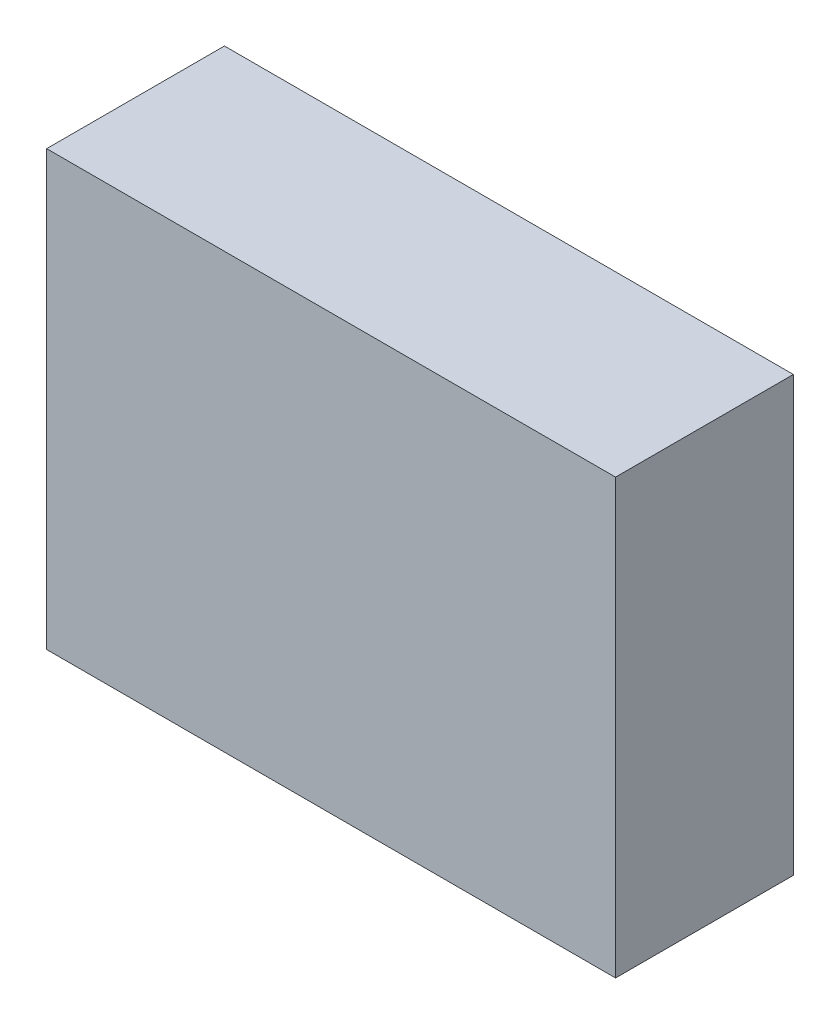
ISO-10303-21;
HEADER;
FILE_DESCRIPTION(('STEP AP214'),'2;1');
FILE_NAME('part.step','',(''),(''),'','','');
FILE_SCHEMA(('AUTOMOTIVE_DESIGN { 1 0 10303 214 1 1 1 1 }'));
ENDSEC;
DATA;
#1=APPLICATION_CONTEXT('core data for automotive mechanical design processes');
#2=APPLICATION_PROTOCOL_DEFINITION('international standard','automotive_design',2000,#1);
#3=PRODUCT_CONTEXT('',#1,'mechanical');
#4=PRODUCT('Part','Part','',(#3));
#5=PRODUCT_RELATED_PRODUCT_CATEGORY('part','',(#4));
#6=PRODUCT_DEFINITION_FORMATION('','',#4);
#7=PRODUCT_DEFINITION_CONTEXT('part definition',#1,'design');
#8=PRODUCT_DEFINITION('design','',#6,#7);
#9=PRODUCT_DEFINITION_SHAPE('','',#8);
#10=(LENGTH_UNIT() NAMED_UNIT(*) SI_UNIT(.MILLI.,.METRE.));
#11=(NAMED_UNIT(*) PLANE_ANGLE_UNIT() SI_UNIT($,.RADIAN.));
#12=(NAMED_UNIT(*) SI_UNIT($,.STERADIAN.) SOLID_ANGLE_UNIT());
#13=UNCERTAINTY_MEASURE_WITH_UNIT(LENGTH_MEASURE(1.E-05),#10,'distance_accuracy_value','');
#14=(GEOMETRIC_REPRESENTATION_CONTEXT(3) GLOBAL_UNCERTAINTY_ASSIGNED_CONTEXT((#13)) GLOBAL_UNIT_ASSIGNED_CONTEXT((#10,
#11,#12)) REPRESENTATION_CONTEXT('',''));
#15=CARTESIAN_POINT('',(0.,0.,0.));
#16=DIRECTION('',(0.,0.,1.));
#17=DIRECTION('',(1.,0.,0.));
#18=AXIS2_PLACEMENT_3D('',#15,#16,#17);
#19=CARTESIAN_POINT('',(-8.00000000000001,-6.1,5.));
#20=DIRECTION('',(1.,0.,0.));
#21=DIRECTION('',(0.,0.,-1.));
#22=AXIS2_PLACEMENT_3D('',#19,#20,#21);
#23=PLANE('',#22);
#24=DIRECTION('',(0.,-1.,0.));
#25=VECTOR('',#24,1.);
#26=CARTESIAN_POINT('',(-8.00000000000001,-6.1,0.));
#27=LINE('',#26,#25);
#28=CARTESIAN_POINT('',(-8.00000000000001,6.1,0.));
#29=VERTEX_POINT('',#28);
#30=CARTESIAN_POINT('',(-8.00000000000001,-6.1,0.));
#31=VERTEX_POINT('',#30);
#32=EDGE_CURVE('E101',#29,#31,#27,.T.);
#33=ORIENTED_EDGE('',*,*,#32,.T.);
#34=DIRECTION('',(0.,0.,-1.));
#35=VECTOR('',#34,1.);
#36=CARTESIAN_POINT('',(-8.00000000000001,-6.1,5.));
#37=LINE('',#36,#35);
#38=CARTESIAN_POINT('',(-8.00000000000001,-6.1,5.));
#39=VERTEX_POINT('',#38);
#40=EDGE_CURVE('E11',#39,#31,#37,.T.);
#41=ORIENTED_EDGE('',*,*,#40,.F.);
#42=DIRECTION('',(0.,-1.,0.));
#43=VECTOR('',#42,1.);
#44=CARTESIAN_POINT('',(-8.00000000000001,-6.1,5.));
#45=LINE('',#44,#43);
#46=CARTESIAN_POINT('',(-8.00000000000001,6.1,5.));
#47=VERTEX_POINT('',#46);
#48=EDGE_CURVE('E89',#47,#39,#45,.T.);
#49=ORIENTED_EDGE('',*,*,#48,.F.);
#50=DIRECTION('',(0.,0.,-1.));
#51=VECTOR('',#50,1.);
#52=CARTESIAN_POINT('',(-8.00000000000001,6.1,5.));
#53=LINE('',#52,#51);
#54=EDGE_CURVE('E97',#47,#29,#53,.T.);
#55=ORIENTED_EDGE('',*,*,#54,.T.);
#56=EDGE_LOOP('',(#33,#41,#49,#55));
#57=FACE_BOUND('',#56,.T.);
#58=ADVANCED_FACE('F38',(#57),#23,.F.);
#59=CARTESIAN_POINT('',(7.99999999999999,-6.1,5.));
#60=DIRECTION('',(0.,1.,0.));
#61=DIRECTION('',(-1.,0.,0.));
#62=AXIS2_PLACEMENT_3D('',#59,#60,#61);
#63=PLANE('',#62);
#64=DIRECTION('',(1.,0.,0.));
#65=VECTOR('',#64,1.);
#66=CARTESIAN_POINT('',(7.99999999999999,-6.1,0.));
#67=LINE('',#66,#65);
#68=CARTESIAN_POINT('',(7.99999999999999,-6.1,0.));
#69=VERTEX_POINT('',#68);
#70=EDGE_CURVE('E93',#31,#69,#67,.T.);
#71=ORIENTED_EDGE('',*,*,#70,.T.);
#72=DIRECTION('',(0.,0.,-1.));
#73=VECTOR('',#72,1.);
#74=CARTESIAN_POINT('',(7.99999999999999,-6.1,5.));
#75=LINE('',#74,#73);
#76=CARTESIAN_POINT('',(7.99999999999999,-6.1,5.));
#77=VERTEX_POINT('',#76);
#78=EDGE_CURVE('E46',#77,#69,#75,.T.);
#79=ORIENTED_EDGE('',*,*,#78,.F.);
#80=DIRECTION('',(1.,0.,0.));
#81=VECTOR('',#80,1.);
#82=CARTESIAN_POINT('',(7.99999999999999,-6.1,5.));
#83=LINE('',#82,#81);
#84=EDGE_CURVE('E84',#39,#77,#83,.T.);
#85=ORIENTED_EDGE('',*,*,#84,.F.);
#86=ORIENTED_EDGE('',*,*,#40,.T.);
#87=EDGE_LOOP('',(#71,#79,#85,#86));
#88=FACE_BOUND('',#87,.T.);
#89=ADVANCED_FACE('F92',(#88),#63,.F.);
#90=CARTESIAN_POINT('',(7.99999999999999,-6.1,5.));
#91=DIRECTION('',(-1.,0.,0.));
#92=DIRECTION('',(0.,0.,1.));
#93=AXIS2_PLACEMENT_3D('',#90,#91,#92);
#94=PLANE('',#93);
#95=DIRECTION('',(0.,1.,0.));
#96=VECTOR('',#95,1.);
#97=CARTESIAN_POINT('',(7.99999999999999,-6.1,0.));
#98=LINE('',#97,#96);
#99=CARTESIAN_POINT('',(7.99999999999999,6.1,0.));
#100=VERTEX_POINT('',#99);
#101=EDGE_CURVE('E71',#69,#100,#98,.T.);
#102=ORIENTED_EDGE('',*,*,#101,.T.);
#103=DIRECTION('',(0.,0.,-1.));
#104=VECTOR('',#103,1.);
#105=CARTESIAN_POINT('',(7.99999999999999,6.1,5.));
#106=LINE('',#105,#104);
#107=CARTESIAN_POINT('',(7.99999999999999,6.1,5.));
#108=VERTEX_POINT('',#107);
#109=EDGE_CURVE('E94',#108,#100,#106,.T.);
#110=ORIENTED_EDGE('',*,*,#109,.F.);
#111=DIRECTION('',(0.,1.,0.));
#112=VECTOR('',#111,1.);
#113=CARTESIAN_POINT('',(7.99999999999999,-6.1,5.));
#114=LINE('',#113,#112);
#115=EDGE_CURVE('E87',#77,#108,#114,.T.);
#116=ORIENTED_EDGE('',*,*,#115,.F.);
#117=ORIENTED_EDGE('',*,*,#78,.T.);
#118=EDGE_LOOP('',(#102,#110,#116,#117));
#119=FACE_BOUND('',#118,.T.);
#120=ADVANCED_FACE('F95',(#119),#94,.F.);
#121=CARTESIAN_POINT('',(7.99999999999999,6.1,5.));
#122=DIRECTION('',(0.,-1.,0.));
#123=DIRECTION('',(1.,0.,0.));
#124=AXIS2_PLACEMENT_3D('',#121,#122,#123);
#125=PLANE('',#124);
#126=DIRECTION('',(-1.,0.,0.));
#127=VECTOR('',#126,1.);
#128=CARTESIAN_POINT('',(7.99999999999999,6.1,0.));
#129=LINE('',#128,#127);
#130=EDGE_CURVE('E77',#100,#29,#129,.T.);
#131=ORIENTED_EDGE('',*,*,#130,.T.);
#132=ORIENTED_EDGE('',*,*,#54,.F.);
#133=DIRECTION('',(-1.,0.,0.));
#134=VECTOR('',#133,1.);
#135=CARTESIAN_POINT('',(7.99999999999999,6.1,5.));
#136=LINE('',#135,#134);
#137=EDGE_CURVE('E54',#108,#47,#136,.T.);
#138=ORIENTED_EDGE('',*,*,#137,.F.);
#139=ORIENTED_EDGE('',*,*,#109,.T.);
#140=EDGE_LOOP('',(#131,#132,#138,#139));
#141=FACE_BOUND('',#140,.T.);
#142=ADVANCED_FACE('F108',(#141),#125,.F.);
#143=CARTESIAN_POINT('',(0.,0.,5.));
#144=DIRECTION('',(0.,0.,1.));
#145=DIRECTION('',(1.,0.,0.));
#146=AXIS2_PLACEMENT_3D('',#143,#144,#145);
#147=PLANE('',#146);
#148=ORIENTED_EDGE('',*,*,#48,.T.);
#149=ORIENTED_EDGE('',*,*,#84,.T.);
#150=ORIENTED_EDGE('',*,*,#115,.T.);
#151=ORIENTED_EDGE('',*,*,#137,.T.);
#152=EDGE_LOOP('',(#148,#149,#150,#151));
#153=FACE_BOUND('',#152,.T.);
#154=ADVANCED_FACE('F85',(#153),#147,.T.);
#155=CARTESIAN_POINT('',(0.,0.,0.));
#156=DIRECTION('',(0.,0.,1.));
#157=DIRECTION('',(1.,0.,0.));
#158=AXIS2_PLACEMENT_3D('',#155,#156,#157);
#159=PLANE('',#158);
#160=ORIENTED_EDGE('',*,*,#32,.F.);
#161=ORIENTED_EDGE('',*,*,#130,.F.);
#162=ORIENTED_EDGE('',*,*,#101,.F.);
#163=ORIENTED_EDGE('',*,*,#70,.F.);
#164=EDGE_LOOP('',(#160,#161,#162,#163));
#165=FACE_BOUND('',#164,.T.);
#166=ADVANCED_FACE('F111',(#165),#159,.F.);
#167=CLOSED_SHELL('',(#58,#89,#120,#142,#154,#166));
#168=MANIFOLD_SOLID_BREP('B2',#167);
#169=ADVANCED_BREP_SHAPE_REPRESENTATION('',(#18,#168),#14);
#170=SHAPE_DEFINITION_REPRESENTATION(#9,#169);
ENDSEC;
END-ISO-10303-21;
